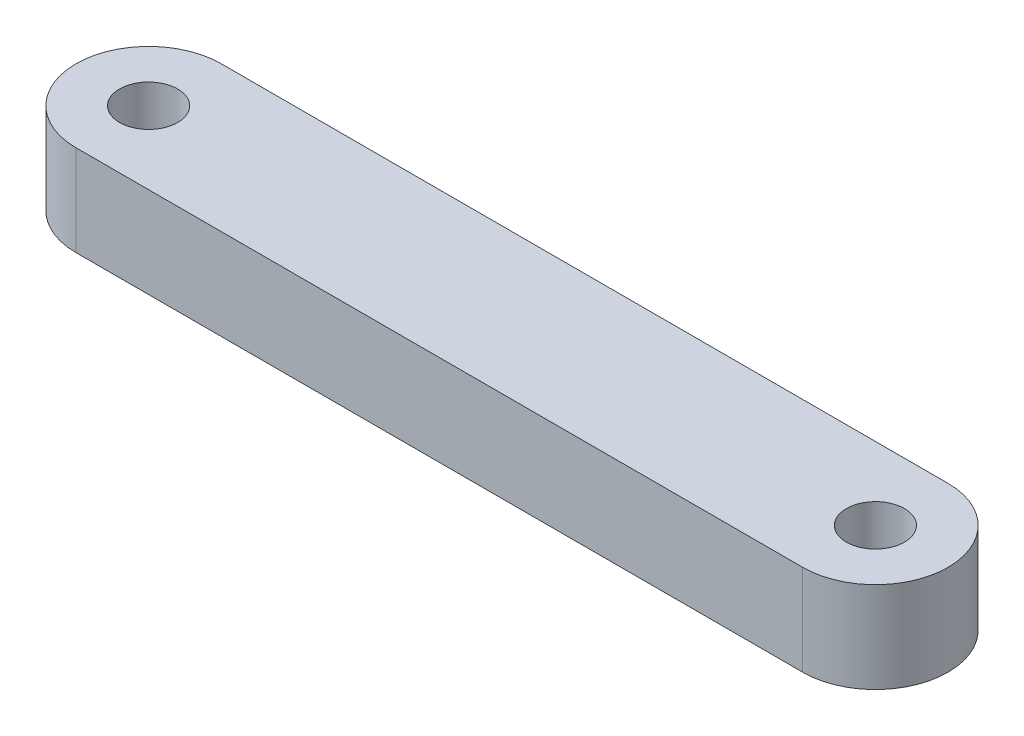
ISO-10303-21;
HEADER;
FILE_DESCRIPTION(('STEP AP214'),'2;1');
FILE_NAME('part.step','',(''),(''),'','','');
FILE_SCHEMA(('AUTOMOTIVE_DESIGN { 1 0 10303 214 1 1 1 1 }'));
ENDSEC;
DATA;
#1=APPLICATION_CONTEXT('core data for automotive mechanical design processes');
#2=APPLICATION_PROTOCOL_DEFINITION('international standard','automotive_design',2000,#1);
#3=PRODUCT_CONTEXT('',#1,'mechanical');
#4=PRODUCT('Part','Part','',(#3));
#5=PRODUCT_RELATED_PRODUCT_CATEGORY('part','',(#4));
#6=PRODUCT_DEFINITION_FORMATION('','',#4);
#7=PRODUCT_DEFINITION_CONTEXT('part definition',#1,'design');
#8=PRODUCT_DEFINITION('design','',#6,#7);
#9=PRODUCT_DEFINITION_SHAPE('','',#8);
#10=(LENGTH_UNIT() NAMED_UNIT(*) SI_UNIT(.MILLI.,.METRE.));
#11=(NAMED_UNIT(*) PLANE_ANGLE_UNIT() SI_UNIT($,.RADIAN.));
#12=(NAMED_UNIT(*) SI_UNIT($,.STERADIAN.) SOLID_ANGLE_UNIT());
#13=UNCERTAINTY_MEASURE_WITH_UNIT(LENGTH_MEASURE(1.E-05),#10,'distance_accuracy_value','');
#14=(GEOMETRIC_REPRESENTATION_CONTEXT(3) GLOBAL_UNCERTAINTY_ASSIGNED_CONTEXT((#13)) GLOBAL_UNIT_ASSIGNED_CONTEXT((#10,
#11,#12)) REPRESENTATION_CONTEXT('',''));
#15=CARTESIAN_POINT('',(0.,0.,0.));
#16=DIRECTION('',(0.,0.,1.));
#17=DIRECTION('',(1.,0.,0.));
#18=AXIS2_PLACEMENT_3D('',#15,#16,#17);
#19=CARTESIAN_POINT('',(20.,5.,0.));
#20=DIRECTION('',(0.,1.,0.));
#21=DIRECTION('',(0.,0.,1.));
#22=AXIS2_PLACEMENT_3D('',#19,#20,#21);
#23=PLANE('',#22);
#24=CARTESIAN_POINT('',(20.,5.,0.));
#25=DIRECTION('',(0.,1.,0.));
#26=DIRECTION('',(0.,0.,1.));
#27=AXIS2_PLACEMENT_3D('',#24,#25,#26);
#28=CIRCLE('',#27,1.6);
#29=CARTESIAN_POINT('',(20.,5.,1.6));
#30=VERTEX_POINT('',#29);
#31=EDGE_CURVE('E112',#30,#30,#28,.T.);
#32=ORIENTED_EDGE('',*,*,#31,.F.);
#33=EDGE_LOOP('',(#32));
#34=FACE_BOUND('',#33,.T.);
#35=CARTESIAN_POINT('',(20.,5.,0.));
#36=DIRECTION('',(0.,1.,0.));
#37=DIRECTION('',(0.,0.,1.));
#38=AXIS2_PLACEMENT_3D('',#35,#36,#37);
#39=CIRCLE('',#38,4.);
#40=CARTESIAN_POINT('',(20.,5.,4.));
#41=VERTEX_POINT('',#40);
#42=CARTESIAN_POINT('',(20.,5.,-4.));
#43=VERTEX_POINT('',#42);
#44=EDGE_CURVE('E92',#41,#43,#39,.T.);
#45=ORIENTED_EDGE('',*,*,#44,.T.);
#46=DIRECTION('',(-1.,0.,0.));
#47=VECTOR('',#46,1.);
#48=CARTESIAN_POINT('',(20.,5.,-4.));
#49=LINE('',#48,#47);
#50=CARTESIAN_POINT('',(-20.,5.,-3.99999999999999));
#51=VERTEX_POINT('',#50);
#52=EDGE_CURVE('E87',#43,#51,#49,.T.);
#53=ORIENTED_EDGE('',*,*,#52,.T.);
#54=CARTESIAN_POINT('',(-20.,5.,0.));
#55=DIRECTION('',(0.,1.,0.));
#56=DIRECTION('',(0.,0.,1.));
#57=AXIS2_PLACEMENT_3D('',#54,#55,#56);
#58=CIRCLE('',#57,4.);
#59=CARTESIAN_POINT('',(-20.,5.,4.));
#60=VERTEX_POINT('',#59);
#61=EDGE_CURVE('E90',#51,#60,#58,.T.);
#62=ORIENTED_EDGE('',*,*,#61,.T.);
#63=DIRECTION('',(1.,0.,0.));
#64=VECTOR('',#63,1.);
#65=CARTESIAN_POINT('',(20.,5.,4.));
#66=LINE('',#65,#64);
#67=EDGE_CURVE('E57',#60,#41,#66,.T.);
#68=ORIENTED_EDGE('',*,*,#67,.T.);
#69=EDGE_LOOP('',(#45,#53,#62,#68));
#70=FACE_BOUND('',#69,.T.);
#71=CARTESIAN_POINT('',(-20.,5.,0.));
#72=DIRECTION('',(0.,1.,0.));
#73=DIRECTION('',(0.,0.,1.));
#74=AXIS2_PLACEMENT_3D('',#71,#72,#73);
#75=CIRCLE('',#74,1.6);
#76=CARTESIAN_POINT('',(-20.,5.,1.6));
#77=VERTEX_POINT('',#76);
#78=EDGE_CURVE('E134',#77,#77,#75,.T.);
#79=ORIENTED_EDGE('',*,*,#78,.F.);
#80=EDGE_LOOP('',(#79));
#81=FACE_BOUND('',#80,.T.);
#82=ADVANCED_FACE('F39',(#34,#70,#81),#23,.T.);
#83=CARTESIAN_POINT('',(20.,0.,0.));
#84=DIRECTION('',(0.,1.,0.));
#85=DIRECTION('',(0.,0.,1.));
#86=AXIS2_PLACEMENT_3D('',#83,#84,#85);
#87=PLANE('',#86);
#88=CARTESIAN_POINT('',(20.,0.,0.));
#89=DIRECTION('',(0.,1.,0.));
#90=DIRECTION('',(0.,0.,1.));
#91=AXIS2_PLACEMENT_3D('',#88,#89,#90);
#92=CIRCLE('',#91,4.);
#93=CARTESIAN_POINT('',(20.,0.,4.));
#94=VERTEX_POINT('',#93);
#95=CARTESIAN_POINT('',(20.,0.,-4.));
#96=VERTEX_POINT('',#95);
#97=EDGE_CURVE('E108',#94,#96,#92,.T.);
#98=ORIENTED_EDGE('',*,*,#97,.F.);
#99=DIRECTION('',(1.,0.,0.));
#100=VECTOR('',#99,1.);
#101=CARTESIAN_POINT('',(20.,0.,4.));
#102=LINE('',#101,#100);
#103=CARTESIAN_POINT('',(-20.,0.,4.));
#104=VERTEX_POINT('',#103);
#105=EDGE_CURVE('E80',#104,#94,#102,.T.);
#106=ORIENTED_EDGE('',*,*,#105,.F.);
#107=CARTESIAN_POINT('',(-20.,0.,0.));
#108=DIRECTION('',(0.,1.,0.));
#109=DIRECTION('',(0.,0.,1.));
#110=AXIS2_PLACEMENT_3D('',#107,#108,#109);
#111=CIRCLE('',#110,4.);
#112=CARTESIAN_POINT('',(-20.,0.,-3.99999999999999));
#113=VERTEX_POINT('',#112);
#114=EDGE_CURVE('E74',#113,#104,#111,.T.);
#115=ORIENTED_EDGE('',*,*,#114,.F.);
#116=DIRECTION('',(-1.,0.,0.));
#117=VECTOR('',#116,1.);
#118=CARTESIAN_POINT('',(20.,0.,-4.));
#119=LINE('',#118,#117);
#120=EDGE_CURVE('E97',#96,#113,#119,.T.);
#121=ORIENTED_EDGE('',*,*,#120,.F.);
#122=EDGE_LOOP('',(#98,#106,#115,#121));
#123=FACE_BOUND('',#122,.T.);
#124=CARTESIAN_POINT('',(20.,0.,0.));
#125=DIRECTION('',(0.,1.,0.));
#126=DIRECTION('',(0.,0.,1.));
#127=AXIS2_PLACEMENT_3D('',#124,#125,#126);
#128=CIRCLE('',#127,1.6);
#129=CARTESIAN_POINT('',(20.,0.,1.6));
#130=VERTEX_POINT('',#129);
#131=EDGE_CURVE('E130',#130,#130,#128,.T.);
#132=ORIENTED_EDGE('',*,*,#131,.T.);
#133=EDGE_LOOP('',(#132));
#134=FACE_BOUND('',#133,.T.);
#135=CARTESIAN_POINT('',(-20.,0.,0.));
#136=DIRECTION('',(0.,1.,0.));
#137=DIRECTION('',(0.,0.,1.));
#138=AXIS2_PLACEMENT_3D('',#135,#136,#137);
#139=CIRCLE('',#138,1.6);
#140=CARTESIAN_POINT('',(-20.,0.,1.6));
#141=VERTEX_POINT('',#140);
#142=EDGE_CURVE('E138',#141,#141,#139,.T.);
#143=ORIENTED_EDGE('',*,*,#142,.T.);
#144=EDGE_LOOP('',(#143));
#145=FACE_BOUND('',#144,.T.);
#146=ADVANCED_FACE('F125',(#123,#134,#145),#87,.F.);
#147=CARTESIAN_POINT('',(20.,5.,0.));
#148=DIRECTION('',(0.,-1.,0.));
#149=DIRECTION('',(0.,0.,-1.));
#150=AXIS2_PLACEMENT_3D('',#147,#148,#149);
#151=CYLINDRICAL_SURFACE('',#150,4.);
#152=ORIENTED_EDGE('',*,*,#97,.T.);
#153=DIRECTION('',(0.,-1.,0.));
#154=VECTOR('',#153,1.);
#155=CARTESIAN_POINT('',(20.,5.,-4.));
#156=LINE('',#155,#154);
#157=EDGE_CURVE('E11',#43,#96,#156,.T.);
#158=ORIENTED_EDGE('',*,*,#157,.F.);
#159=ORIENTED_EDGE('',*,*,#44,.F.);
#160=DIRECTION('',(0.,-1.,0.));
#161=VECTOR('',#160,1.);
#162=CARTESIAN_POINT('',(20.,5.,4.));
#163=LINE('',#162,#161);
#164=EDGE_CURVE('E104',#41,#94,#163,.T.);
#165=ORIENTED_EDGE('',*,*,#164,.T.);
#166=EDGE_LOOP('',(#152,#158,#159,#165));
#167=FACE_BOUND('',#166,.T.);
#168=ADVANCED_FACE('F41',(#167),#151,.T.);
#169=CARTESIAN_POINT('',(20.,5.,-4.));
#170=DIRECTION('',(0.,0.,1.));
#171=DIRECTION('',(1.,0.,0.));
#172=AXIS2_PLACEMENT_3D('',#169,#170,#171);
#173=PLANE('',#172);
#174=ORIENTED_EDGE('',*,*,#120,.T.);
#175=DIRECTION('',(0.,-1.,0.));
#176=VECTOR('',#175,1.);
#177=CARTESIAN_POINT('',(-20.,5.,-3.99999999999999));
#178=LINE('',#177,#176);
#179=EDGE_CURVE('E49',#51,#113,#178,.T.);
#180=ORIENTED_EDGE('',*,*,#179,.F.);
#181=ORIENTED_EDGE('',*,*,#52,.F.);
#182=ORIENTED_EDGE('',*,*,#157,.T.);
#183=EDGE_LOOP('',(#174,#180,#181,#182));
#184=FACE_BOUND('',#183,.T.);
#185=ADVANCED_FACE('F96',(#184),#173,.F.);
#186=CARTESIAN_POINT('',(-20.,5.,0.));
#187=DIRECTION('',(0.,-1.,0.));
#188=DIRECTION('',(0.,0.,-1.));
#189=AXIS2_PLACEMENT_3D('',#186,#187,#188);
#190=CYLINDRICAL_SURFACE('',#189,4.);
#191=ORIENTED_EDGE('',*,*,#114,.T.);
#192=DIRECTION('',(0.,-1.,0.));
#193=VECTOR('',#192,1.);
#194=CARTESIAN_POINT('',(-20.,5.,4.));
#195=LINE('',#194,#193);
#196=EDGE_CURVE('E99',#60,#104,#195,.T.);
#197=ORIENTED_EDGE('',*,*,#196,.F.);
#198=ORIENTED_EDGE('',*,*,#61,.F.);
#199=ORIENTED_EDGE('',*,*,#179,.T.);
#200=EDGE_LOOP('',(#191,#197,#198,#199));
#201=FACE_BOUND('',#200,.T.);
#202=ADVANCED_FACE('F100',(#201),#190,.T.);
#203=CARTESIAN_POINT('',(20.,5.,4.));
#204=DIRECTION('',(0.,0.,-1.));
#205=DIRECTION('',(-1.,0.,0.));
#206=AXIS2_PLACEMENT_3D('',#203,#204,#205);
#207=PLANE('',#206);
#208=ORIENTED_EDGE('',*,*,#105,.T.);
#209=ORIENTED_EDGE('',*,*,#164,.F.);
#210=ORIENTED_EDGE('',*,*,#67,.F.);
#211=ORIENTED_EDGE('',*,*,#196,.T.);
#212=EDGE_LOOP('',(#208,#209,#210,#211));
#213=FACE_BOUND('',#212,.T.);
#214=ADVANCED_FACE('F122',(#213),#207,.F.);
#215=CARTESIAN_POINT('',(20.,5.,0.));
#216=DIRECTION('',(0.,-1.,0.));
#217=DIRECTION('',(0.,0.,-1.));
#218=AXIS2_PLACEMENT_3D('',#215,#216,#217);
#219=CYLINDRICAL_SURFACE('',#218,1.6);
#220=ORIENTED_EDGE('',*,*,#31,.T.);
#221=EDGE_LOOP('',(#220));
#222=FACE_BOUND('',#221,.T.);
#223=ORIENTED_EDGE('',*,*,#131,.F.);
#224=EDGE_LOOP('',(#223));
#225=FACE_BOUND('',#224,.T.);
#226=ADVANCED_FACE('F157',(#222,#225),#219,.F.);
#227=CARTESIAN_POINT('',(-20.,5.,0.));
#228=DIRECTION('',(0.,-1.,0.));
#229=DIRECTION('',(0.,0.,-1.));
#230=AXIS2_PLACEMENT_3D('',#227,#228,#229);
#231=CYLINDRICAL_SURFACE('',#230,1.6);
#232=ORIENTED_EDGE('',*,*,#78,.T.);
#233=EDGE_LOOP('',(#232));
#234=FACE_BOUND('',#233,.T.);
#235=ORIENTED_EDGE('',*,*,#142,.F.);
#236=EDGE_LOOP('',(#235));
#237=FACE_BOUND('',#236,.T.);
#238=ADVANCED_FACE('F146',(#234,#237),#231,.F.);
#239=CLOSED_SHELL('',(#82,#146,#168,#185,#202,#214,#226,#238));
#240=MANIFOLD_SOLID_BREP('B2',#239);
#241=ADVANCED_BREP_SHAPE_REPRESENTATION('',(#18,#240),#14);
#242=SHAPE_DEFINITION_REPRESENTATION(#9,#241);
ENDSEC;
END-ISO-10303-21;
